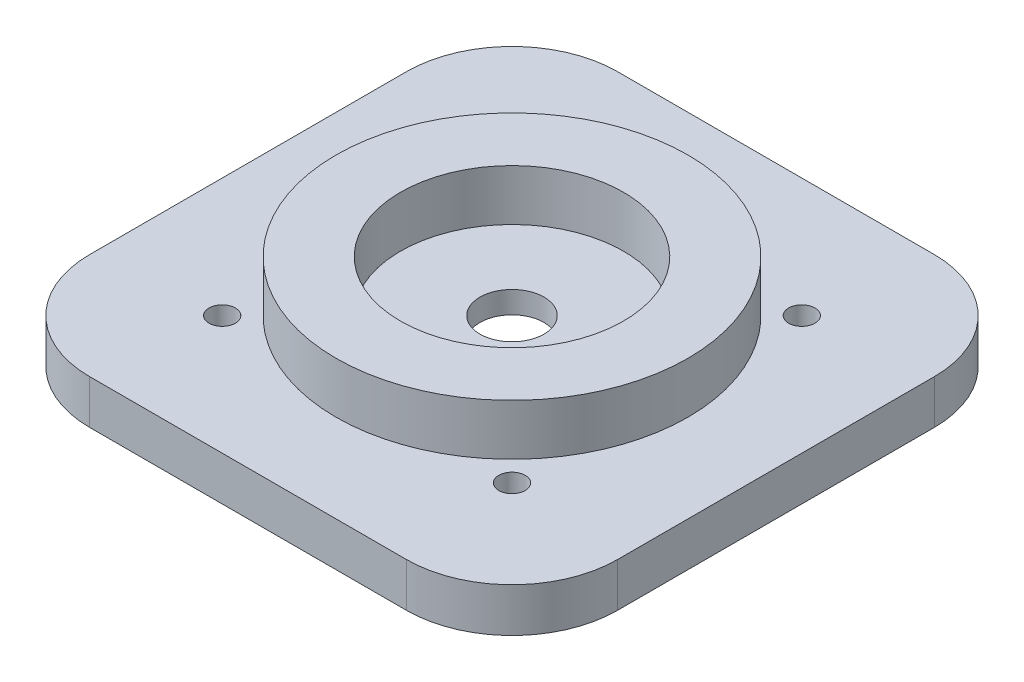
ISO-10303-21;
HEADER;
FILE_DESCRIPTION(('STEP AP214'),'2;1');
FILE_NAME('part.step','',(''),(''),'','','');
FILE_SCHEMA(('AUTOMOTIVE_DESIGN { 1 0 10303 214 1 1 1 1 }'));
ENDSEC;
DATA;
#1=APPLICATION_CONTEXT('core data for automotive mechanical design processes');
#2=APPLICATION_PROTOCOL_DEFINITION('international standard','automotive_design',2000,#1);
#3=PRODUCT_CONTEXT('',#1,'mechanical');
#4=PRODUCT('Part','Part','',(#3));
#5=PRODUCT_RELATED_PRODUCT_CATEGORY('part','',(#4));
#6=PRODUCT_DEFINITION_FORMATION('','',#4);
#7=PRODUCT_DEFINITION_CONTEXT('part definition',#1,'design');
#8=PRODUCT_DEFINITION('design','',#6,#7);
#9=PRODUCT_DEFINITION_SHAPE('','',#8);
#10=(LENGTH_UNIT() NAMED_UNIT(*) SI_UNIT(.MILLI.,.METRE.));
#11=(NAMED_UNIT(*) PLANE_ANGLE_UNIT() SI_UNIT($,.RADIAN.));
#12=(NAMED_UNIT(*) SI_UNIT($,.STERADIAN.) SOLID_ANGLE_UNIT());
#13=UNCERTAINTY_MEASURE_WITH_UNIT(LENGTH_MEASURE(1.E-05),#10,'distance_accuracy_value','');
#14=(GEOMETRIC_REPRESENTATION_CONTEXT(3) GLOBAL_UNCERTAINTY_ASSIGNED_CONTEXT((#13)) GLOBAL_UNIT_ASSIGNED_CONTEXT((#10,
#11,#12)) REPRESENTATION_CONTEXT('',''));
#15=CARTESIAN_POINT('',(0.,0.,0.));
#16=DIRECTION('',(0.,0.,1.));
#17=DIRECTION('',(1.,0.,0.));
#18=AXIS2_PLACEMENT_3D('',#15,#16,#17);
#19=CARTESIAN_POINT('',(0.,6.35,0.));
#20=DIRECTION('',(0.,1.,0.));
#21=DIRECTION('',(0.,0.,1.));
#22=AXIS2_PLACEMENT_3D('',#19,#20,#21);
#23=PLANE('',#22);
#24=CARTESIAN_POINT('',(25.4,6.35,-25.4));
#25=DIRECTION('',(0.,1.,0.));
#26=DIRECTION('',(0.,0.,1.));
#27=AXIS2_PLACEMENT_3D('',#24,#25,#26);
#28=CIRCLE('',#27,4.625);
#29=CARTESIAN_POINT('',(25.4,6.35,-20.775));
#30=VERTEX_POINT('',#29);
#31=EDGE_CURVE('E188',#30,#30,#28,.T.);
#32=ORIENTED_EDGE('',*,*,#31,.F.);
#33=EDGE_LOOP('',(#32));
#34=FACE_BOUND('',#33,.T.);
#35=CARTESIAN_POINT('',(25.4,6.35,-25.4));
#36=DIRECTION('',(0.,1.,0.));
#37=DIRECTION('',(0.,0.,1.));
#38=AXIS2_PLACEMENT_3D('',#35,#36,#37);
#39=CIRCLE('',#38,16.1);
#40=CARTESIAN_POINT('',(25.4,6.35,-9.3));
#41=VERTEX_POINT('',#40);
#42=EDGE_CURVE('E13',#41,#41,#39,.F.);
#43=ORIENTED_EDGE('',*,*,#42,.F.);
#44=EDGE_LOOP('',(#43));
#45=FACE_BOUND('',#44,.T.);
#46=ADVANCED_FACE('F50',(#34,#45),#23,.T.);
#47=CARTESIAN_POINT('',(25.4,6.35,-25.4));
#48=DIRECTION('',(0.,-1.,0.));
#49=DIRECTION('',(0.,0.,-1.));
#50=AXIS2_PLACEMENT_3D('',#47,#48,#49);
#51=CYLINDRICAL_SURFACE('',#50,4.625);
#52=ORIENTED_EDGE('',*,*,#31,.T.);
#53=EDGE_LOOP('',(#52));
#54=FACE_BOUND('',#53,.T.);
#55=CARTESIAN_POINT('',(25.4,3.175,-25.4));
#56=DIRECTION('',(0.,-1.,0.));
#57=DIRECTION('',(0.,0.,-1.));
#58=AXIS2_PLACEMENT_3D('',#55,#56,#57);
#59=CIRCLE('',#58,4.625);
#60=CARTESIAN_POINT('',(25.4,3.175,-30.025));
#61=VERTEX_POINT('',#60);
#62=EDGE_CURVE('E175',#61,#61,#59,.T.);
#63=ORIENTED_EDGE('',*,*,#62,.T.);
#64=EDGE_LOOP('',(#63));
#65=FACE_BOUND('',#64,.T.);
#66=ADVANCED_FACE('F213',(#54,#65),#51,.F.);
#67=CARTESIAN_POINT('',(46.3098719394654,6.35,-4.49012806053457));
#68=DIRECTION('',(0.,-1.,0.));
#69=DIRECTION('',(0.,0.,-1.));
#70=AXIS2_PLACEMENT_3D('',#67,#68,#69);
#71=CYLINDRICAL_SURFACE('',#70,1.905);
#72=CARTESIAN_POINT('',(46.3098719394654,6.35,-4.49012806053457));
#73=DIRECTION('',(0.,1.,0.));
#74=DIRECTION('',(0.,0.,1.));
#75=AXIS2_PLACEMENT_3D('',#72,#73,#74);
#76=CIRCLE('',#75,1.905);
#77=CARTESIAN_POINT('',(46.3098719394654,6.35,-2.58512806053457));
#78=VERTEX_POINT('',#77);
#79=EDGE_CURVE('E195',#78,#78,#76,.T.);
#80=ORIENTED_EDGE('',*,*,#79,.T.);
#81=EDGE_LOOP('',(#80));
#82=FACE_BOUND('',#81,.T.);
#83=CARTESIAN_POINT('',(46.3098719394654,0.,-4.49012806053457));
#84=DIRECTION('',(0.,1.,0.));
#85=DIRECTION('',(0.,0.,1.));
#86=AXIS2_PLACEMENT_3D('',#83,#84,#85);
#87=CIRCLE('',#86,1.905);
#88=CARTESIAN_POINT('',(46.3098719394654,0.,-2.58512806053457));
#89=VERTEX_POINT('',#88);
#90=EDGE_CURVE('E206',#89,#89,#87,.T.);
#91=ORIENTED_EDGE('',*,*,#90,.F.);
#92=EDGE_LOOP('',(#91));
#93=FACE_BOUND('',#92,.T.);
#94=ADVANCED_FACE('F238',(#82,#93),#71,.F.);
#95=CARTESIAN_POINT('',(4.49012806053457,6.35,-4.49012806053457));
#96=DIRECTION('',(0.,-1.,0.));
#97=DIRECTION('',(0.,0.,-1.));
#98=AXIS2_PLACEMENT_3D('',#95,#96,#97);
#99=CYLINDRICAL_SURFACE('',#98,1.905);
#100=CARTESIAN_POINT('',(4.49012806053457,0.,-4.49012806053457));
#101=DIRECTION('',(0.,1.,0.));
#102=DIRECTION('',(0.,0.,1.));
#103=AXIS2_PLACEMENT_3D('',#100,#101,#102);
#104=CIRCLE('',#103,1.905);
#105=CARTESIAN_POINT('',(4.49012806053457,0.,-2.58512806053458));
#106=VERTEX_POINT('',#105);
#107=EDGE_CURVE('E203',#106,#106,#104,.F.);
#108=ORIENTED_EDGE('',*,*,#107,.T.);
#109=EDGE_LOOP('',(#108));
#110=FACE_BOUND('',#109,.T.);
#111=CARTESIAN_POINT('',(4.49012806053457,6.35,-4.49012806053457));
#112=DIRECTION('',(0.,1.,0.));
#113=DIRECTION('',(0.,0.,1.));
#114=AXIS2_PLACEMENT_3D('',#111,#112,#113);
#115=CIRCLE('',#114,1.905);
#116=CARTESIAN_POINT('',(4.49012806053457,6.35,-2.58512806053458));
#117=VERTEX_POINT('',#116);
#118=EDGE_CURVE('E192',#117,#117,#115,.F.);
#119=ORIENTED_EDGE('',*,*,#118,.F.);
#120=EDGE_LOOP('',(#119));
#121=FACE_BOUND('',#120,.T.);
#122=ADVANCED_FACE('F625',(#110,#121),#99,.F.);
#123=CARTESIAN_POINT('',(4.49012806053457,6.35,-46.3098719394654));
#124=DIRECTION('',(0.,-1.,0.));
#125=DIRECTION('',(0.,0.,-1.));
#126=AXIS2_PLACEMENT_3D('',#123,#124,#125);
#127=CYLINDRICAL_SURFACE('',#126,1.905);
#128=CARTESIAN_POINT('',(4.49012806053457,6.35,-46.3098719394654));
#129=DIRECTION('',(0.,1.,0.));
#130=DIRECTION('',(0.,0.,1.));
#131=AXIS2_PLACEMENT_3D('',#128,#129,#130);
#132=CIRCLE('',#131,1.905);
#133=CARTESIAN_POINT('',(4.49012806053457,6.35,-44.4048719394654));
#134=VERTEX_POINT('',#133);
#135=EDGE_CURVE('E185',#134,#134,#132,.T.);
#136=ORIENTED_EDGE('',*,*,#135,.T.);
#137=EDGE_LOOP('',(#136));
#138=FACE_BOUND('',#137,.T.);
#139=CARTESIAN_POINT('',(4.49012806053457,0.,-46.3098719394654));
#140=DIRECTION('',(0.,1.,0.));
#141=DIRECTION('',(0.,0.,1.));
#142=AXIS2_PLACEMENT_3D('',#139,#140,#141);
#143=CIRCLE('',#142,1.905);
#144=CARTESIAN_POINT('',(4.49012806053457,0.,-44.4048719394654));
#145=VERTEX_POINT('',#144);
#146=EDGE_CURVE('E200',#145,#145,#143,.T.);
#147=ORIENTED_EDGE('',*,*,#146,.F.);
#148=EDGE_LOOP('',(#147));
#149=FACE_BOUND('',#148,.T.);
#150=ADVANCED_FACE('F52',(#138,#149),#127,.F.);
#151=CARTESIAN_POINT('',(46.3098719394654,6.35,-46.3098719394654));
#152=DIRECTION('',(0.,-1.,0.));
#153=DIRECTION('',(0.,0.,-1.));
#154=AXIS2_PLACEMENT_3D('',#151,#152,#153);
#155=CYLINDRICAL_SURFACE('',#154,1.905);
#156=CARTESIAN_POINT('',(46.3098719394654,6.35,-46.3098719394654));
#157=DIRECTION('',(0.,1.,0.));
#158=DIRECTION('',(0.,0.,1.));
#159=AXIS2_PLACEMENT_3D('',#156,#157,#158);
#160=CIRCLE('',#159,1.905);
#161=CARTESIAN_POINT('',(46.3098719394654,6.35,-44.4048719394654));
#162=VERTEX_POINT('',#161);
#163=EDGE_CURVE('E58',#162,#162,#160,.F.);
#164=ORIENTED_EDGE('',*,*,#163,.F.);
#165=EDGE_LOOP('',(#164));
#166=FACE_BOUND('',#165,.T.);
#167=CARTESIAN_POINT('',(46.3098719394654,0.,-46.3098719394654));
#168=DIRECTION('',(0.,1.,0.));
#169=DIRECTION('',(0.,0.,1.));
#170=AXIS2_PLACEMENT_3D('',#167,#168,#169);
#171=CIRCLE('',#170,1.905);
#172=CARTESIAN_POINT('',(46.3098719394654,0.,-44.4048719394654));
#173=VERTEX_POINT('',#172);
#174=EDGE_CURVE('E189',#173,#173,#171,.F.);
#175=ORIENTED_EDGE('',*,*,#174,.T.);
#176=EDGE_LOOP('',(#175));
#177=FACE_BOUND('',#176,.T.);
#178=ADVANCED_FACE('F246',(#166,#177),#155,.F.);
#179=CARTESIAN_POINT('',(25.4,6.35,-25.4));
#180=DIRECTION('',(0.,1.,0.));
#181=DIRECTION('',(0.,0.,1.));
#182=AXIS2_PLACEMENT_3D('',#179,#180,#181);
#183=CIRCLE('',#182,25.4);
#184=CARTESIAN_POINT('',(25.4,6.35,0.));
#185=VERTEX_POINT('',#184);
#186=EDGE_CURVE('E259',#185,#185,#183,.T.);
#187=ORIENTED_EDGE('',*,*,#186,.F.);
#188=EDGE_LOOP('',(#187));
#189=FACE_BOUND('',#188,.T.);
#190=ORIENTED_EDGE('',*,*,#135,.F.);
#191=EDGE_LOOP('',(#190));
#192=FACE_BOUND('',#191,.T.);
#193=ORIENTED_EDGE('',*,*,#118,.T.);
#194=EDGE_LOOP('',(#193));
#195=FACE_BOUND('',#194,.T.);
#196=ORIENTED_EDGE('',*,*,#79,.F.);
#197=EDGE_LOOP('',(#196));
#198=FACE_BOUND('',#197,.T.);
#199=ORIENTED_EDGE('',*,*,#163,.T.);
#200=EDGE_LOOP('',(#199));
#201=FACE_BOUND('',#200,.T.);
#202=CARTESIAN_POINT('',(48.26,6.35,-2.54));
#203=DIRECTION('',(0.,1.,0.));
#204=DIRECTION('',(0.,0.,1.));
#205=AXIS2_PLACEMENT_3D('',#202,#203,#204);
#206=CIRCLE('',#205,15.24);
#207=CARTESIAN_POINT('',(48.26,6.35,12.7));
#208=VERTEX_POINT('',#207);
#209=CARTESIAN_POINT('',(63.5,6.35,-2.54));
#210=VERTEX_POINT('',#209);
#211=EDGE_CURVE('E273',#208,#210,#206,.T.);
#212=ORIENTED_EDGE('',*,*,#211,.T.);
#213=DIRECTION('',(0.,0.,-1.));
#214=VECTOR('',#213,1.);
#215=CARTESIAN_POINT('',(63.5,6.35,-2.54));
#216=LINE('',#215,#214);
#217=CARTESIAN_POINT('',(63.5,6.35,-48.26));
#218=VERTEX_POINT('',#217);
#219=EDGE_CURVE('E277',#210,#218,#216,.T.);
#220=ORIENTED_EDGE('',*,*,#219,.T.);
#221=CARTESIAN_POINT('',(48.26,6.35,-48.26));
#222=DIRECTION('',(0.,1.,0.));
#223=DIRECTION('',(0.,0.,1.));
#224=AXIS2_PLACEMENT_3D('',#221,#222,#223);
#225=CIRCLE('',#224,15.24);
#226=CARTESIAN_POINT('',(48.26,6.35,-63.5));
#227=VERTEX_POINT('',#226);
#228=EDGE_CURVE('E288',#218,#227,#225,.T.);
#229=ORIENTED_EDGE('',*,*,#228,.T.);
#230=DIRECTION('',(-1.,0.,0.));
#231=VECTOR('',#230,1.);
#232=CARTESIAN_POINT('',(48.26,6.35,-63.5));
#233=LINE('',#232,#231);
#234=CARTESIAN_POINT('',(2.54,6.35,-63.5));
#235=VERTEX_POINT('',#234);
#236=EDGE_CURVE('E297',#227,#235,#233,.T.);
#237=ORIENTED_EDGE('',*,*,#236,.T.);
#238=CARTESIAN_POINT('',(2.54,6.35,-48.26));
#239=DIRECTION('',(0.,1.,0.));
#240=DIRECTION('',(0.,0.,1.));
#241=AXIS2_PLACEMENT_3D('',#238,#239,#240);
#242=CIRCLE('',#241,15.24);
#243=CARTESIAN_POINT('',(-12.7,6.35,-48.26));
#244=VERTEX_POINT('',#243);
#245=EDGE_CURVE('E300',#235,#244,#242,.T.);
#246=ORIENTED_EDGE('',*,*,#245,.T.);
#247=DIRECTION('',(0.,0.,1.));
#248=VECTOR('',#247,1.);
#249=CARTESIAN_POINT('',(-12.7,6.35,-48.26));
#250=LINE('',#249,#248);
#251=CARTESIAN_POINT('',(-12.7,6.35,-2.54));
#252=VERTEX_POINT('',#251);
#253=EDGE_CURVE('E303',#244,#252,#250,.T.);
#254=ORIENTED_EDGE('',*,*,#253,.T.);
#255=CARTESIAN_POINT('',(2.54,6.35,-2.54));
#256=DIRECTION('',(0.,1.,0.));
#257=DIRECTION('',(0.,0.,1.));
#258=AXIS2_PLACEMENT_3D('',#255,#256,#257);
#259=CIRCLE('',#258,15.24);
#260=CARTESIAN_POINT('',(2.54,6.35,12.7));
#261=VERTEX_POINT('',#260);
#262=EDGE_CURVE('E306',#252,#261,#259,.T.);
#263=ORIENTED_EDGE('',*,*,#262,.T.);
#264=DIRECTION('',(1.,0.,0.));
#265=VECTOR('',#264,1.);
#266=CARTESIAN_POINT('',(2.54,6.35,12.7));
#267=LINE('',#266,#265);
#268=EDGE_CURVE('E281',#261,#208,#267,.T.);
#269=ORIENTED_EDGE('',*,*,#268,.T.);
#270=EDGE_LOOP('',(#212,#220,#229,#237,#246,#254,#263,#269));
#271=FACE_BOUND('',#270,.T.);
#272=ADVANCED_FACE('F234',(#189,#192,#195,#198,#201,#271),#23,.T.);
#273=CARTESIAN_POINT('',(0.,0.,0.));
#274=DIRECTION('',(0.,1.,0.));
#275=DIRECTION('',(0.,0.,1.));
#276=AXIS2_PLACEMENT_3D('',#273,#274,#275);
#277=PLANE('',#276);
#278=DIRECTION('',(0.,0.,-1.));
#279=VECTOR('',#278,1.);
#280=CARTESIAN_POINT('',(4.49012806053457,0.,-40.5948719394654));
#281=LINE('',#280,#279);
#282=CARTESIAN_POINT('',(4.49012806053457,0.,-10.2051280605346));
#283=VERTEX_POINT('',#282);
#284=CARTESIAN_POINT('',(4.49012806053457,0.,-40.5948719394654));
#285=VERTEX_POINT('',#284);
#286=EDGE_CURVE('E155',#283,#285,#281,.T.);
#287=ORIENTED_EDGE('',*,*,#286,.F.);
#288=CARTESIAN_POINT('',(4.49012806053457,0.,-4.49012806053457));
#289=DIRECTION('',(0.,1.,0.));
#290=DIRECTION('',(0.,0.,-1.));
#291=AXIS2_PLACEMENT_3D('',#288,#289,#290);
#292=CIRCLE('',#291,5.715);
#293=CARTESIAN_POINT('',(10.2051280605346,0.,-4.49012806053457));
#294=VERTEX_POINT('',#293);
#295=EDGE_CURVE('E65',#294,#283,#292,.T.);
#296=ORIENTED_EDGE('',*,*,#295,.F.);
#297=DIRECTION('',(-1.,0.,0.));
#298=VECTOR('',#297,1.);
#299=CARTESIAN_POINT('',(10.2051280605346,0.,-4.49012806053457));
#300=LINE('',#299,#298);
#301=CARTESIAN_POINT('',(40.5948719394654,0.,-4.49012806053457));
#302=VERTEX_POINT('',#301);
#303=EDGE_CURVE('E171',#302,#294,#300,.T.);
#304=ORIENTED_EDGE('',*,*,#303,.F.);
#305=CARTESIAN_POINT('',(46.3098719394654,0.,-4.49012806053457));
#306=DIRECTION('',(0.,1.,0.));
#307=DIRECTION('',(0.,0.,-1.));
#308=AXIS2_PLACEMENT_3D('',#305,#306,#307);
#309=CIRCLE('',#308,5.715);
#310=CARTESIAN_POINT('',(46.3098719394654,0.,-10.2051280605346));
#311=VERTEX_POINT('',#310);
#312=EDGE_CURVE('E169',#311,#302,#309,.T.);
#313=ORIENTED_EDGE('',*,*,#312,.F.);
#314=DIRECTION('',(0.,0.,1.));
#315=VECTOR('',#314,1.);
#316=CARTESIAN_POINT('',(46.3098719394654,0.,-10.2051280605346));
#317=LINE('',#316,#315);
#318=CARTESIAN_POINT('',(46.3098719394654,0.,-40.5948719394654));
#319=VERTEX_POINT('',#318);
#320=EDGE_CURVE('E129',#319,#311,#317,.T.);
#321=ORIENTED_EDGE('',*,*,#320,.F.);
#322=CARTESIAN_POINT('',(46.3098719394654,0.,-46.3098719394654));
#323=DIRECTION('',(0.,1.,0.));
#324=DIRECTION('',(0.,0.,-1.));
#325=AXIS2_PLACEMENT_3D('',#322,#323,#324);
#326=CIRCLE('',#325,5.715);
#327=CARTESIAN_POINT('',(40.5948719394654,0.,-46.3098719394654));
#328=VERTEX_POINT('',#327);
#329=EDGE_CURVE('E165',#328,#319,#326,.T.);
#330=ORIENTED_EDGE('',*,*,#329,.F.);
#331=DIRECTION('',(1.,0.,0.));
#332=VECTOR('',#331,1.);
#333=CARTESIAN_POINT('',(40.5948719394654,0.,-46.3098719394654));
#334=LINE('',#333,#332);
#335=CARTESIAN_POINT('',(10.2051280605346,0.,-46.3098719394654));
#336=VERTEX_POINT('',#335);
#337=EDGE_CURVE('E162',#336,#328,#334,.T.);
#338=ORIENTED_EDGE('',*,*,#337,.F.);
#339=CARTESIAN_POINT('',(4.49012806053457,0.,-46.3098719394654));
#340=DIRECTION('',(0.,1.,0.));
#341=DIRECTION('',(0.,0.,-1.));
#342=AXIS2_PLACEMENT_3D('',#339,#340,#341);
#343=CIRCLE('',#342,5.715);
#344=EDGE_CURVE('E159',#285,#336,#343,.T.);
#345=ORIENTED_EDGE('',*,*,#344,.F.);
#346=EDGE_LOOP('',(#287,#296,#304,#313,#321,#330,#338,#345));
#347=FACE_BOUND('',#346,.T.);
#348=ORIENTED_EDGE('',*,*,#146,.T.);
#349=EDGE_LOOP('',(#348));
#350=FACE_BOUND('',#349,.T.);
#351=ORIENTED_EDGE('',*,*,#107,.F.);
#352=EDGE_LOOP('',(#351));
#353=FACE_BOUND('',#352,.T.);
#354=ORIENTED_EDGE('',*,*,#90,.T.);
#355=EDGE_LOOP('',(#354));
#356=FACE_BOUND('',#355,.T.);
#357=ORIENTED_EDGE('',*,*,#174,.F.);
#358=EDGE_LOOP('',(#357));
#359=FACE_BOUND('',#358,.T.);
#360=CARTESIAN_POINT('',(48.26,0.,-2.54));
#361=DIRECTION('',(0.,1.,0.));
#362=DIRECTION('',(0.,0.,1.));
#363=AXIS2_PLACEMENT_3D('',#360,#361,#362);
#364=CIRCLE('',#363,15.24);
#365=CARTESIAN_POINT('',(63.5,0.,-2.54));
#366=VERTEX_POINT('',#365);
#367=CARTESIAN_POINT('',(48.26,0.,12.7));
#368=VERTEX_POINT('',#367);
#369=EDGE_CURVE('E293',#366,#368,#364,.F.);
#370=ORIENTED_EDGE('',*,*,#369,.T.);
#371=DIRECTION('',(-1.,0.,0.));
#372=VECTOR('',#371,1.);
#373=CARTESIAN_POINT('',(2.54,0.,12.7));
#374=LINE('',#373,#372);
#375=CARTESIAN_POINT('',(2.54,0.,12.7));
#376=VERTEX_POINT('',#375);
#377=EDGE_CURVE('E542',#368,#376,#374,.T.);
#378=ORIENTED_EDGE('',*,*,#377,.T.);
#379=CARTESIAN_POINT('',(2.54,0.,-2.54));
#380=DIRECTION('',(0.,1.,0.));
#381=DIRECTION('',(0.,0.,1.));
#382=AXIS2_PLACEMENT_3D('',#379,#380,#381);
#383=CIRCLE('',#382,15.24);
#384=CARTESIAN_POINT('',(-12.7,0.,-2.54));
#385=VERTEX_POINT('',#384);
#386=EDGE_CURVE('E540',#376,#385,#383,.F.);
#387=ORIENTED_EDGE('',*,*,#386,.T.);
#388=DIRECTION('',(0.,0.,-1.));
#389=VECTOR('',#388,1.);
#390=CARTESIAN_POINT('',(-12.7,0.,-48.26));
#391=LINE('',#390,#389);
#392=CARTESIAN_POINT('',(-12.7,0.,-48.26));
#393=VERTEX_POINT('',#392);
#394=EDGE_CURVE('E537',#385,#393,#391,.T.);
#395=ORIENTED_EDGE('',*,*,#394,.T.);
#396=CARTESIAN_POINT('',(2.54,0.,-48.26));
#397=DIRECTION('',(0.,1.,0.));
#398=DIRECTION('',(0.,0.,1.));
#399=AXIS2_PLACEMENT_3D('',#396,#397,#398);
#400=CIRCLE('',#399,15.24);
#401=CARTESIAN_POINT('',(2.54,0.,-63.5));
#402=VERTEX_POINT('',#401);
#403=EDGE_CURVE('E534',#393,#402,#400,.F.);
#404=ORIENTED_EDGE('',*,*,#403,.T.);
#405=DIRECTION('',(1.,0.,0.));
#406=VECTOR('',#405,1.);
#407=CARTESIAN_POINT('',(48.26,0.,-63.5));
#408=LINE('',#407,#406);
#409=CARTESIAN_POINT('',(48.26,0.,-63.5));
#410=VERTEX_POINT('',#409);
#411=EDGE_CURVE('E531',#402,#410,#408,.T.);
#412=ORIENTED_EDGE('',*,*,#411,.T.);
#413=CARTESIAN_POINT('',(48.26,0.,-48.26));
#414=DIRECTION('',(0.,1.,0.));
#415=DIRECTION('',(0.,0.,1.));
#416=AXIS2_PLACEMENT_3D('',#413,#414,#415);
#417=CIRCLE('',#416,15.24);
#418=CARTESIAN_POINT('',(63.5,0.,-48.26));
#419=VERTEX_POINT('',#418);
#420=EDGE_CURVE('E313',#410,#419,#417,.F.);
#421=ORIENTED_EDGE('',*,*,#420,.T.);
#422=DIRECTION('',(0.,0.,1.));
#423=VECTOR('',#422,1.);
#424=CARTESIAN_POINT('',(63.5,0.,-2.54));
#425=LINE('',#424,#423);
#426=EDGE_CURVE('E156',#419,#366,#425,.T.);
#427=ORIENTED_EDGE('',*,*,#426,.T.);
#428=EDGE_LOOP('',(#370,#378,#387,#395,#404,#412,#421,#427));
#429=FACE_BOUND('',#428,.T.);
#430=ADVANCED_FACE('F245',(#347,#350,#353,#356,#359,#429),#277,.F.);
#431=CARTESIAN_POINT('',(4.49012806053457,3.175,-4.49012806053457));
#432=DIRECTION('',(0.,-1.,0.));
#433=DIRECTION('',(0.,0.,-1.));
#434=AXIS2_PLACEMENT_3D('',#431,#432,#433);
#435=CYLINDRICAL_SURFACE('',#434,5.715);
#436=ORIENTED_EDGE('',*,*,#295,.T.);
#437=DIRECTION('',(0.,-1.,0.));
#438=VECTOR('',#437,1.);
#439=CARTESIAN_POINT('',(4.49012806053457,3.175,-10.2051280605346));
#440=LINE('',#439,#438);
#441=CARTESIAN_POINT('',(4.49012806053457,3.175,-10.2051280605346));
#442=VERTEX_POINT('',#441);
#443=EDGE_CURVE('E102',#442,#283,#440,.T.);
#444=ORIENTED_EDGE('',*,*,#443,.F.);
#445=CARTESIAN_POINT('',(4.49012806053457,3.175,-4.49012806053457));
#446=DIRECTION('',(0.,1.,0.));
#447=DIRECTION('',(0.,0.,-1.));
#448=AXIS2_PLACEMENT_3D('',#445,#446,#447);
#449=CIRCLE('',#448,5.715);
#450=CARTESIAN_POINT('',(10.2051280605346,3.175,-4.49012806053457));
#451=VERTEX_POINT('',#450);
#452=EDGE_CURVE('E173',#451,#442,#449,.T.);
#453=ORIENTED_EDGE('',*,*,#452,.F.);
#454=DIRECTION('',(0.,-1.,0.));
#455=VECTOR('',#454,1.);
#456=CARTESIAN_POINT('',(10.2051280605346,3.175,-4.49012806053457));
#457=LINE('',#456,#455);
#458=EDGE_CURVE('E73',#451,#294,#457,.T.);
#459=ORIENTED_EDGE('',*,*,#458,.T.);
#460=EDGE_LOOP('',(#436,#444,#453,#459));
#461=FACE_BOUND('',#460,.T.);
#462=ADVANCED_FACE('F252',(#461),#435,.T.);
#463=CARTESIAN_POINT('',(10.2051280605346,3.175,-4.49012806053457));
#464=DIRECTION('',(0.,0.,1.));
#465=DIRECTION('',(1.,0.,0.));
#466=AXIS2_PLACEMENT_3D('',#463,#464,#465);
#467=PLANE('',#466);
#468=ORIENTED_EDGE('',*,*,#303,.T.);
#469=ORIENTED_EDGE('',*,*,#458,.F.);
#470=DIRECTION('',(-1.,0.,0.));
#471=VECTOR('',#470,1.);
#472=CARTESIAN_POINT('',(10.2051280605346,3.175,-4.49012806053457));
#473=LINE('',#472,#471);
#474=CARTESIAN_POINT('',(40.5948719394654,3.175,-4.49012806053457));
#475=VERTEX_POINT('',#474);
#476=EDGE_CURVE('E141',#475,#451,#473,.T.);
#477=ORIENTED_EDGE('',*,*,#476,.F.);
#478=DIRECTION('',(0.,-1.,0.));
#479=VECTOR('',#478,1.);
#480=CARTESIAN_POINT('',(40.5948719394654,3.175,-4.49012806053457));
#481=LINE('',#480,#479);
#482=EDGE_CURVE('E133',#475,#302,#481,.T.);
#483=ORIENTED_EDGE('',*,*,#482,.T.);
#484=EDGE_LOOP('',(#468,#469,#477,#483));
#485=FACE_BOUND('',#484,.T.);
#486=ADVANCED_FACE('F350',(#485),#467,.F.);
#487=CARTESIAN_POINT('',(46.3098719394654,3.175,-4.49012806053457));
#488=DIRECTION('',(0.,-1.,0.));
#489=DIRECTION('',(0.,0.,-1.));
#490=AXIS2_PLACEMENT_3D('',#487,#488,#489);
#491=CYLINDRICAL_SURFACE('',#490,5.715);
#492=ORIENTED_EDGE('',*,*,#312,.T.);
#493=ORIENTED_EDGE('',*,*,#482,.F.);
#494=CARTESIAN_POINT('',(46.3098719394654,3.175,-4.49012806053457));
#495=DIRECTION('',(0.,1.,0.));
#496=DIRECTION('',(0.,0.,-1.));
#497=AXIS2_PLACEMENT_3D('',#494,#495,#496);
#498=CIRCLE('',#497,5.715);
#499=CARTESIAN_POINT('',(46.3098719394654,3.175,-10.2051280605346));
#500=VERTEX_POINT('',#499);
#501=EDGE_CURVE('E137',#500,#475,#498,.T.);
#502=ORIENTED_EDGE('',*,*,#501,.F.);
#503=DIRECTION('',(0.,-1.,0.));
#504=VECTOR('',#503,1.);
#505=CARTESIAN_POINT('',(46.3098719394654,3.175,-10.2051280605346));
#506=LINE('',#505,#504);
#507=EDGE_CURVE('E122',#500,#311,#506,.T.);
#508=ORIENTED_EDGE('',*,*,#507,.T.);
#509=EDGE_LOOP('',(#492,#493,#502,#508));
#510=FACE_BOUND('',#509,.T.);
#511=ADVANCED_FACE('F138',(#510),#491,.T.);
#512=CARTESIAN_POINT('',(46.3098719394654,3.175,-10.2051280605346));
#513=DIRECTION('',(1.,0.,0.));
#514=DIRECTION('',(0.,0.,-1.));
#515=AXIS2_PLACEMENT_3D('',#512,#513,#514);
#516=PLANE('',#515);
#517=ORIENTED_EDGE('',*,*,#320,.T.);
#518=ORIENTED_EDGE('',*,*,#507,.F.);
#519=DIRECTION('',(0.,0.,1.));
#520=VECTOR('',#519,1.);
#521=CARTESIAN_POINT('',(46.3098719394654,3.175,-10.2051280605346));
#522=LINE('',#521,#520);
#523=CARTESIAN_POINT('',(46.3098719394654,3.175,-40.5948719394654));
#524=VERTEX_POINT('',#523);
#525=EDGE_CURVE('E126',#524,#500,#522,.T.);
#526=ORIENTED_EDGE('',*,*,#525,.F.);
#527=DIRECTION('',(0.,-1.,0.));
#528=VECTOR('',#527,1.);
#529=CARTESIAN_POINT('',(46.3098719394654,3.175,-40.5948719394654));
#530=LINE('',#529,#528);
#531=EDGE_CURVE('E134',#524,#319,#530,.T.);
#532=ORIENTED_EDGE('',*,*,#531,.T.);
#533=EDGE_LOOP('',(#517,#518,#526,#532));
#534=FACE_BOUND('',#533,.T.);
#535=ADVANCED_FACE('F124',(#534),#516,.F.);
#536=CARTESIAN_POINT('',(46.3098719394654,3.175,-46.3098719394654));
#537=DIRECTION('',(0.,-1.,0.));
#538=DIRECTION('',(0.,0.,-1.));
#539=AXIS2_PLACEMENT_3D('',#536,#537,#538);
#540=CYLINDRICAL_SURFACE('',#539,5.715);
#541=ORIENTED_EDGE('',*,*,#329,.T.);
#542=ORIENTED_EDGE('',*,*,#531,.F.);
#543=CARTESIAN_POINT('',(46.3098719394654,3.175,-46.3098719394654));
#544=DIRECTION('',(0.,1.,0.));
#545=DIRECTION('',(0.,0.,-1.));
#546=AXIS2_PLACEMENT_3D('',#543,#544,#545);
#547=CIRCLE('',#546,5.715);
#548=CARTESIAN_POINT('',(40.5948719394654,3.175,-46.3098719394654));
#549=VERTEX_POINT('',#548);
#550=EDGE_CURVE('E147',#549,#524,#547,.T.);
#551=ORIENTED_EDGE('',*,*,#550,.F.);
#552=DIRECTION('',(0.,-1.,0.));
#553=VECTOR('',#552,1.);
#554=CARTESIAN_POINT('',(40.5948719394654,3.175,-46.3098719394654));
#555=LINE('',#554,#553);
#556=EDGE_CURVE('E178',#549,#328,#555,.T.);
#557=ORIENTED_EDGE('',*,*,#556,.T.);
#558=EDGE_LOOP('',(#541,#542,#551,#557));
#559=FACE_BOUND('',#558,.T.);
#560=ADVANCED_FACE('F346',(#559),#540,.T.);
#561=CARTESIAN_POINT('',(40.5948719394654,3.175,-46.3098719394654));
#562=DIRECTION('',(0.,0.,-1.));
#563=DIRECTION('',(-1.,0.,0.));
#564=AXIS2_PLACEMENT_3D('',#561,#562,#563);
#565=PLANE('',#564);
#566=ORIENTED_EDGE('',*,*,#337,.T.);
#567=ORIENTED_EDGE('',*,*,#556,.F.);
#568=DIRECTION('',(1.,0.,0.));
#569=VECTOR('',#568,1.);
#570=CARTESIAN_POINT('',(40.5948719394654,3.175,-46.3098719394654));
#571=LINE('',#570,#569);
#572=CARTESIAN_POINT('',(10.2051280605346,3.175,-46.3098719394654));
#573=VERTEX_POINT('',#572);
#574=EDGE_CURVE('E149',#573,#549,#571,.T.);
#575=ORIENTED_EDGE('',*,*,#574,.F.);
#576=DIRECTION('',(0.,-1.,0.));
#577=VECTOR('',#576,1.);
#578=CARTESIAN_POINT('',(10.2051280605346,3.175,-46.3098719394654));
#579=LINE('',#578,#577);
#580=EDGE_CURVE('E180',#573,#336,#579,.T.);
#581=ORIENTED_EDGE('',*,*,#580,.T.);
#582=EDGE_LOOP('',(#566,#567,#575,#581));
#583=FACE_BOUND('',#582,.T.);
#584=ADVANCED_FACE('F342',(#583),#565,.F.);
#585=CARTESIAN_POINT('',(4.49012806053457,3.175,-46.3098719394654));
#586=DIRECTION('',(0.,-1.,0.));
#587=DIRECTION('',(0.,0.,-1.));
#588=AXIS2_PLACEMENT_3D('',#585,#586,#587);
#589=CYLINDRICAL_SURFACE('',#588,5.715);
#590=ORIENTED_EDGE('',*,*,#344,.T.);
#591=ORIENTED_EDGE('',*,*,#580,.F.);
#592=CARTESIAN_POINT('',(4.49012806053457,3.175,-46.3098719394654));
#593=DIRECTION('',(0.,1.,0.));
#594=DIRECTION('',(0.,0.,-1.));
#595=AXIS2_PLACEMENT_3D('',#592,#593,#594);
#596=CIRCLE('',#595,5.715);
#597=CARTESIAN_POINT('',(4.49012806053457,3.175,-40.5948719394654));
#598=VERTEX_POINT('',#597);
#599=EDGE_CURVE('E337',#598,#573,#596,.T.);
#600=ORIENTED_EDGE('',*,*,#599,.F.);
#601=DIRECTION('',(0.,-1.,0.));
#602=VECTOR('',#601,1.);
#603=CARTESIAN_POINT('',(4.49012806053457,3.175,-40.5948719394654));
#604=LINE('',#603,#602);
#605=EDGE_CURVE('E182',#598,#285,#604,.T.);
#606=ORIENTED_EDGE('',*,*,#605,.T.);
#607=EDGE_LOOP('',(#590,#591,#600,#606));
#608=FACE_BOUND('',#607,.T.);
#609=ADVANCED_FACE('F226',(#608),#589,.T.);
#610=CARTESIAN_POINT('',(4.49012806053457,3.175,-40.5948719394654));
#611=DIRECTION('',(-1.,0.,0.));
#612=DIRECTION('',(0.,0.,1.));
#613=AXIS2_PLACEMENT_3D('',#610,#611,#612);
#614=PLANE('',#613);
#615=ORIENTED_EDGE('',*,*,#286,.T.);
#616=ORIENTED_EDGE('',*,*,#605,.F.);
#617=DIRECTION('',(0.,0.,-1.));
#618=VECTOR('',#617,1.);
#619=CARTESIAN_POINT('',(4.49012806053457,3.175,-40.5948719394654));
#620=LINE('',#619,#618);
#621=EDGE_CURVE('E334',#442,#598,#620,.T.);
#622=ORIENTED_EDGE('',*,*,#621,.F.);
#623=ORIENTED_EDGE('',*,*,#443,.T.);
#624=EDGE_LOOP('',(#615,#616,#622,#623));
#625=FACE_BOUND('',#624,.T.);
#626=ADVANCED_FACE('F217',(#625),#614,.F.);
#627=CARTESIAN_POINT('',(4.49012806053457,3.175,-4.49012806053457));
#628=DIRECTION('',(0.,-1.,0.));
#629=DIRECTION('',(0.,0.,-1.));
#630=AXIS2_PLACEMENT_3D('',#627,#628,#629);
#631=PLANE('',#630);
#632=ORIENTED_EDGE('',*,*,#62,.F.);
#633=EDGE_LOOP('',(#632));
#634=FACE_BOUND('',#633,.T.);
#635=ORIENTED_EDGE('',*,*,#452,.T.);
#636=ORIENTED_EDGE('',*,*,#621,.T.);
#637=ORIENTED_EDGE('',*,*,#599,.T.);
#638=ORIENTED_EDGE('',*,*,#574,.T.);
#639=ORIENTED_EDGE('',*,*,#550,.T.);
#640=ORIENTED_EDGE('',*,*,#525,.T.);
#641=ORIENTED_EDGE('',*,*,#501,.T.);
#642=ORIENTED_EDGE('',*,*,#476,.T.);
#643=EDGE_LOOP('',(#635,#636,#637,#638,#639,#640,#641,#642));
#644=FACE_BOUND('',#643,.T.);
#645=ADVANCED_FACE('F144',(#634,#644),#631,.T.);
#646=CARTESIAN_POINT('',(63.5,-107.76307345283,-2.54));
#647=DIRECTION('',(1.,0.,0.));
#648=DIRECTION('',(0.,0.,-1.));
#649=AXIS2_PLACEMENT_3D('',#646,#647,#648);
#650=PLANE('',#649);
#651=ORIENTED_EDGE('',*,*,#426,.F.);
#652=DIRECTION('',(0.,1.,0.));
#653=VECTOR('',#652,1.);
#654=CARTESIAN_POINT('',(63.5,-107.76307345283,-48.26));
#655=LINE('',#654,#653);
#656=EDGE_CURVE('E329',#419,#218,#655,.T.);
#657=ORIENTED_EDGE('',*,*,#656,.T.);
#658=ORIENTED_EDGE('',*,*,#219,.F.);
#659=DIRECTION('',(0.,1.,0.));
#660=VECTOR('',#659,1.);
#661=CARTESIAN_POINT('',(63.5,-107.76307345283,-2.54));
#662=LINE('',#661,#660);
#663=EDGE_CURVE('E309',#366,#210,#662,.T.);
#664=ORIENTED_EDGE('',*,*,#663,.F.);
#665=EDGE_LOOP('',(#651,#657,#658,#664));
#666=FACE_BOUND('',#665,.T.);
#667=ADVANCED_FACE('F216',(#666),#650,.T.);
#668=CARTESIAN_POINT('',(48.26,-107.76307345283,-48.26));
#669=DIRECTION('',(0.,1.,0.));
#670=DIRECTION('',(0.,0.,1.));
#671=AXIS2_PLACEMENT_3D('',#668,#669,#670);
#672=CYLINDRICAL_SURFACE('',#671,15.24);
#673=ORIENTED_EDGE('',*,*,#420,.F.);
#674=DIRECTION('',(0.,1.,0.));
#675=VECTOR('',#674,1.);
#676=CARTESIAN_POINT('',(48.26,-107.76307345283,-63.5));
#677=LINE('',#676,#675);
#678=EDGE_CURVE('E326',#410,#227,#677,.T.);
#679=ORIENTED_EDGE('',*,*,#678,.T.);
#680=ORIENTED_EDGE('',*,*,#228,.F.);
#681=ORIENTED_EDGE('',*,*,#656,.F.);
#682=EDGE_LOOP('',(#673,#679,#680,#681));
#683=FACE_BOUND('',#682,.T.);
#684=ADVANCED_FACE('F223',(#683),#672,.T.);
#685=CARTESIAN_POINT('',(48.26,-107.76307345283,-63.5));
#686=DIRECTION('',(0.,0.,-1.));
#687=DIRECTION('',(-1.,0.,0.));
#688=AXIS2_PLACEMENT_3D('',#685,#686,#687);
#689=PLANE('',#688);
#690=ORIENTED_EDGE('',*,*,#411,.F.);
#691=DIRECTION('',(0.,1.,0.));
#692=VECTOR('',#691,1.);
#693=CARTESIAN_POINT('',(2.54,-107.76307345283,-63.5));
#694=LINE('',#693,#692);
#695=EDGE_CURVE('E323',#402,#235,#694,.T.);
#696=ORIENTED_EDGE('',*,*,#695,.T.);
#697=ORIENTED_EDGE('',*,*,#236,.F.);
#698=ORIENTED_EDGE('',*,*,#678,.F.);
#699=EDGE_LOOP('',(#690,#696,#697,#698));
#700=FACE_BOUND('',#699,.T.);
#701=ADVANCED_FACE('F417',(#700),#689,.T.);
#702=CARTESIAN_POINT('',(2.54,-107.76307345283,-48.26));
#703=DIRECTION('',(0.,1.,0.));
#704=DIRECTION('',(0.,0.,1.));
#705=AXIS2_PLACEMENT_3D('',#702,#703,#704);
#706=CYLINDRICAL_SURFACE('',#705,15.24);
#707=ORIENTED_EDGE('',*,*,#403,.F.);
#708=DIRECTION('',(0.,1.,0.));
#709=VECTOR('',#708,1.);
#710=CARTESIAN_POINT('',(-12.7,-107.76307345283,-48.26));
#711=LINE('',#710,#709);
#712=EDGE_CURVE('E320',#393,#244,#711,.T.);
#713=ORIENTED_EDGE('',*,*,#712,.T.);
#714=ORIENTED_EDGE('',*,*,#245,.F.);
#715=ORIENTED_EDGE('',*,*,#695,.F.);
#716=EDGE_LOOP('',(#707,#713,#714,#715));
#717=FACE_BOUND('',#716,.T.);
#718=ADVANCED_FACE('F427',(#717),#706,.T.);
#719=CARTESIAN_POINT('',(-12.7,-107.76307345283,-48.26));
#720=DIRECTION('',(-1.,0.,0.));
#721=DIRECTION('',(0.,0.,1.));
#722=AXIS2_PLACEMENT_3D('',#719,#720,#721);
#723=PLANE('',#722);
#724=ORIENTED_EDGE('',*,*,#394,.F.);
#725=DIRECTION('',(0.,1.,0.));
#726=VECTOR('',#725,1.);
#727=CARTESIAN_POINT('',(-12.7,-107.76307345283,-2.54));
#728=LINE('',#727,#726);
#729=EDGE_CURVE('E317',#385,#252,#728,.T.);
#730=ORIENTED_EDGE('',*,*,#729,.T.);
#731=ORIENTED_EDGE('',*,*,#253,.F.);
#732=ORIENTED_EDGE('',*,*,#712,.F.);
#733=EDGE_LOOP('',(#724,#730,#731,#732));
#734=FACE_BOUND('',#733,.T.);
#735=ADVANCED_FACE('F437',(#734),#723,.T.);
#736=CARTESIAN_POINT('',(2.54,-107.76307345283,-2.54));
#737=DIRECTION('',(0.,1.,0.));
#738=DIRECTION('',(0.,0.,1.));
#739=AXIS2_PLACEMENT_3D('',#736,#737,#738);
#740=CYLINDRICAL_SURFACE('',#739,15.24);
#741=ORIENTED_EDGE('',*,*,#386,.F.);
#742=DIRECTION('',(0.,1.,0.));
#743=VECTOR('',#742,1.);
#744=CARTESIAN_POINT('',(2.54,-107.76307345283,12.7));
#745=LINE('',#744,#743);
#746=EDGE_CURVE('E314',#376,#261,#745,.T.);
#747=ORIENTED_EDGE('',*,*,#746,.T.);
#748=ORIENTED_EDGE('',*,*,#262,.F.);
#749=ORIENTED_EDGE('',*,*,#729,.F.);
#750=EDGE_LOOP('',(#741,#747,#748,#749));
#751=FACE_BOUND('',#750,.T.);
#752=ADVANCED_FACE('F447',(#751),#740,.T.);
#753=CARTESIAN_POINT('',(2.54,-107.76307345283,12.7));
#754=DIRECTION('',(0.,0.,1.));
#755=DIRECTION('',(1.,0.,0.));
#756=AXIS2_PLACEMENT_3D('',#753,#754,#755);
#757=PLANE('',#756);
#758=ORIENTED_EDGE('',*,*,#377,.F.);
#759=DIRECTION('',(0.,1.,0.));
#760=VECTOR('',#759,1.);
#761=CARTESIAN_POINT('',(48.26,-107.76307345283,12.7));
#762=LINE('',#761,#760);
#763=EDGE_CURVE('E310',#368,#208,#762,.T.);
#764=ORIENTED_EDGE('',*,*,#763,.T.);
#765=ORIENTED_EDGE('',*,*,#268,.F.);
#766=ORIENTED_EDGE('',*,*,#746,.F.);
#767=EDGE_LOOP('',(#758,#764,#765,#766));
#768=FACE_BOUND('',#767,.T.);
#769=ADVANCED_FACE('F457',(#768),#757,.T.);
#770=CARTESIAN_POINT('',(48.26,-107.76307345283,-2.54));
#771=DIRECTION('',(0.,1.,0.));
#772=DIRECTION('',(0.,0.,1.));
#773=AXIS2_PLACEMENT_3D('',#770,#771,#772);
#774=CYLINDRICAL_SURFACE('',#773,15.24);
#775=ORIENTED_EDGE('',*,*,#369,.F.);
#776=ORIENTED_EDGE('',*,*,#663,.T.);
#777=ORIENTED_EDGE('',*,*,#211,.F.);
#778=ORIENTED_EDGE('',*,*,#763,.F.);
#779=EDGE_LOOP('',(#775,#776,#777,#778));
#780=FACE_BOUND('',#779,.T.);
#781=ADVANCED_FACE('F467',(#780),#774,.T.);
#782=CARTESIAN_POINT('',(25.4,13.716,-25.4));
#783=DIRECTION('',(0.,1.,0.));
#784=DIRECTION('',(0.,0.,1.));
#785=AXIS2_PLACEMENT_3D('',#782,#783,#784);
#786=PLANE('',#785);
#787=CARTESIAN_POINT('',(25.4,13.716,-25.4));
#788=DIRECTION('',(0.,1.,0.));
#789=DIRECTION('',(0.,0.,1.));
#790=AXIS2_PLACEMENT_3D('',#787,#788,#789);
#791=CIRCLE('',#790,25.4);
#792=CARTESIAN_POINT('',(25.4,13.716,0.));
#793=VERTEX_POINT('',#792);
#794=EDGE_CURVE('E286',#793,#793,#791,.T.);
#795=ORIENTED_EDGE('',*,*,#794,.T.);
#796=EDGE_LOOP('',(#795));
#797=FACE_BOUND('',#796,.T.);
#798=CARTESIAN_POINT('',(25.4,13.716,-25.4));
#799=DIRECTION('',(0.,1.,0.));
#800=DIRECTION('',(0.,0.,1.));
#801=AXIS2_PLACEMENT_3D('',#798,#799,#800);
#802=CIRCLE('',#801,16.1);
#803=CARTESIAN_POINT('',(25.4,13.716,-9.3));
#804=VERTEX_POINT('',#803);
#805=EDGE_CURVE('E521',#804,#804,#802,.T.);
#806=ORIENTED_EDGE('',*,*,#805,.F.);
#807=EDGE_LOOP('',(#806));
#808=FACE_BOUND('',#807,.T.);
#809=ADVANCED_FACE('F476',(#797,#808),#786,.T.);
#810=CARTESIAN_POINT('',(25.4,13.716,-25.4));
#811=DIRECTION('',(0.,-1.,0.));
#812=DIRECTION('',(0.,0.,-1.));
#813=AXIS2_PLACEMENT_3D('',#810,#811,#812);
#814=CYLINDRICAL_SURFACE('',#813,25.4);
#815=ORIENTED_EDGE('',*,*,#794,.F.);
#816=EDGE_LOOP('',(#815));
#817=FACE_BOUND('',#816,.T.);
#818=ORIENTED_EDGE('',*,*,#186,.T.);
#819=EDGE_LOOP('',(#818));
#820=FACE_BOUND('',#819,.T.);
#821=ADVANCED_FACE('F494',(#817,#820),#814,.T.);
#822=CARTESIAN_POINT('',(25.4,13.716,-25.4));
#823=DIRECTION('',(0.,-1.,0.));
#824=DIRECTION('',(0.,0.,-1.));
#825=AXIS2_PLACEMENT_3D('',#822,#823,#824);
#826=CYLINDRICAL_SURFACE('',#825,16.1);
#827=ORIENTED_EDGE('',*,*,#805,.T.);
#828=EDGE_LOOP('',(#827));
#829=FACE_BOUND('',#828,.T.);
#830=ORIENTED_EDGE('',*,*,#42,.T.);
#831=EDGE_LOOP('',(#830));
#832=FACE_BOUND('',#831,.T.);
#833=ADVANCED_FACE('F504',(#829,#832),#826,.F.);
#834=CLOSED_SHELL('',(#46,#66,#94,#122,#150,#178,#272,#430,#462,#486,#511,#535,#560,#584,#609,
#626,#645,#667,#684,#701,#718,#735,#752,#769,#781,#809,#821,#833));
#835=MANIFOLD_SOLID_BREP('B2',#834);
#836=ADVANCED_BREP_SHAPE_REPRESENTATION('',(#18,#835),#14);
#837=SHAPE_DEFINITION_REPRESENTATION(#9,#836);
ENDSEC;
END-ISO-10303-21;
